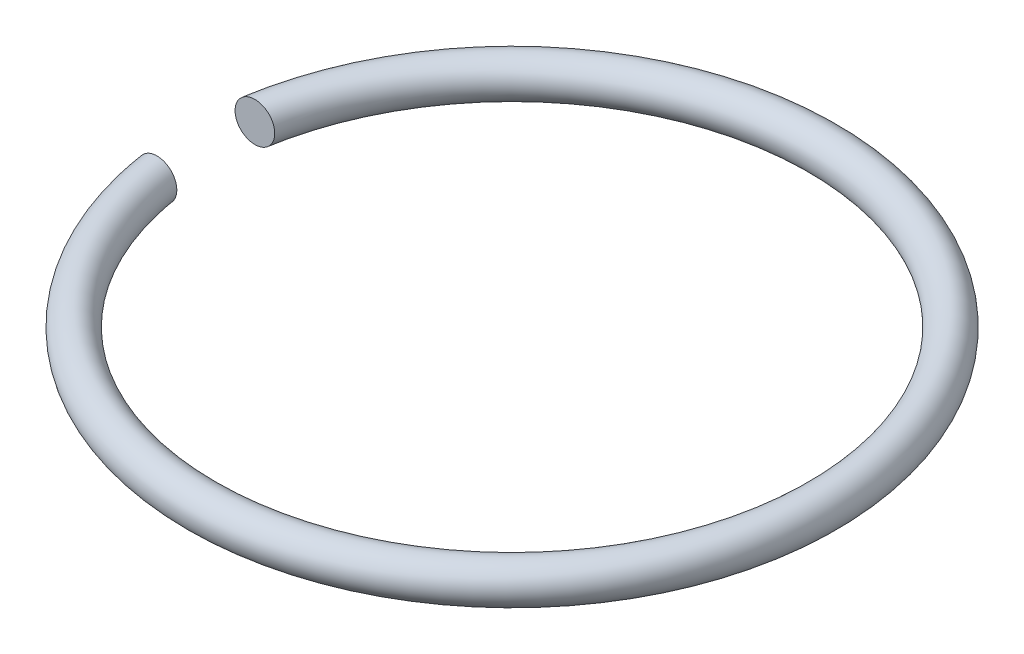
ISO-10303-21;
HEADER;
FILE_DESCRIPTION(('STEP AP214'),'2;1');
FILE_NAME('part.step','',(''),(''),'','','');
FILE_SCHEMA(('AUTOMOTIVE_DESIGN { 1 0 10303 214 1 1 1 1 }'));
ENDSEC;
DATA;
#1=APPLICATION_CONTEXT('core data for automotive mechanical design processes');
#2=APPLICATION_PROTOCOL_DEFINITION('international standard','automotive_design',2000,#1);
#3=PRODUCT_CONTEXT('',#1,'mechanical');
#4=PRODUCT('Part','Part','',(#3));
#5=PRODUCT_RELATED_PRODUCT_CATEGORY('part','',(#4));
#6=PRODUCT_DEFINITION_FORMATION('','',#4);
#7=PRODUCT_DEFINITION_CONTEXT('part definition',#1,'design');
#8=PRODUCT_DEFINITION('design','',#6,#7);
#9=PRODUCT_DEFINITION_SHAPE('','',#8);
#10=(LENGTH_UNIT() NAMED_UNIT(*) SI_UNIT(.MILLI.,.METRE.));
#11=(NAMED_UNIT(*) PLANE_ANGLE_UNIT() SI_UNIT($,.RADIAN.));
#12=(NAMED_UNIT(*) SI_UNIT($,.STERADIAN.) SOLID_ANGLE_UNIT());
#13=UNCERTAINTY_MEASURE_WITH_UNIT(LENGTH_MEASURE(1.E-05),#10,'distance_accuracy_value','');
#14=(GEOMETRIC_REPRESENTATION_CONTEXT(3) GLOBAL_UNCERTAINTY_ASSIGNED_CONTEXT((#13)) GLOBAL_UNIT_ASSIGNED_CONTEXT((#10,
#11,#12)) REPRESENTATION_CONTEXT('',''));
#15=CARTESIAN_POINT('',(0.,0.,0.));
#16=DIRECTION('',(0.,0.,1.));
#17=DIRECTION('',(1.,0.,0.));
#18=AXIS2_PLACEMENT_3D('',#15,#16,#17);
#19=CARTESIAN_POINT('',(0.,0.,0.));
#20=DIRECTION('',(0.,-1.,0.));
#21=DIRECTION('',(0.,0.,-1.));
#22=AXIS2_PLACEMENT_3D('',#19,#20,#21);
#23=TOROIDAL_SURFACE('',#22,9.5,0.6);
#24=CARTESIAN_POINT('',(-9.90918934467898,-0.295694588418098,1.5));
#25=CARTESIAN_POINT('',(-9.89235176297286,-0.325084884106954,1.5));
#26=CARTESIAN_POINT('',(-9.87299806537925,-0.353064009952844,1.5));
#27=CARTESIAN_POINT('',(-9.82983776787072,-0.405386688377729,1.5));
#28=CARTESIAN_POINT('',(-9.8060253157122,-0.429725386394075,1.5));
#29=CARTESIAN_POINT('',(-9.75468320221522,-0.474049548580785,1.5));
#30=CARTESIAN_POINT('',(-9.72715713604399,-0.494039174804915,1.5));
#31=CARTESIAN_POINT('',(-9.6691715035482,-0.529152386603416,1.5));
#32=CARTESIAN_POINT('',(-9.63871265399831,-0.544277157249969,1.5));
#33=CARTESIAN_POINT('',(-9.57544495495714,-0.569381697490342,1.5));
#34=CARTESIAN_POINT('',(-9.54261840053594,-0.579316846333761,1.5));
#35=CARTESIAN_POINT('',(-9.47576880604907,-0.593591583199508,1.5));
#36=CARTESIAN_POINT('',(-9.44174565010229,-0.597930627743449,1.5));
#37=CARTESIAN_POINT('',(-9.373136684303,-0.600918077224366,1.5));
#38=CARTESIAN_POINT('',(-9.33854857626074,-0.599513898799929,1.5));
#39=CARTESIAN_POINT('',(-9.27009432910497,-0.590936971880836,1.5));
#40=CARTESIAN_POINT('',(-9.23622821040076,-0.583764060536236,1.5));
#41=CARTESIAN_POINT('',(-9.17008270539161,-0.563812620001006,1.5));
#42=CARTESIAN_POINT('',(-9.13780811180835,-0.551018187267294,1.5));
#43=CARTESIAN_POINT('',(-9.07588127963409,-0.520163574858099,1.5));
#44=CARTESIAN_POINT('',(-9.04622899087471,-0.502103495950254,1.5));
#45=CARTESIAN_POINT('',(-8.99057485078488,-0.461323184437788,1.5));
#46=CARTESIAN_POINT('',(-8.96455370578505,-0.438629294588949,1.5));
#47=CARTESIAN_POINT('',(-8.91674848738194,-0.389146725096677,1.5));
#48=CARTESIAN_POINT('',(-8.89496414913901,-0.362358301586586,1.5));
#49=CARTESIAN_POINT('',(-8.85653872269795,-0.305792569390791,1.5));
#50=CARTESIAN_POINT('',(-8.83983834203544,-0.276055544304358,1.5));
#51=CARTESIAN_POINT('',(-8.81174427760562,-0.214172183704338,1.5));
#52=CARTESIAN_POINT('',(-8.80035016448414,-0.182026043367625,1.5));
#53=CARTESIAN_POINT('',(-8.78334153808978,-0.116692967203398,1.5));
#54=CARTESIAN_POINT('',(-8.7776527930337,-0.0835253456357243,1.5));
#55=CARTESIAN_POINT('',(-8.7719711356941,-0.0167063948460827,1.5));
#56=CARTESIAN_POINT('',(-8.77197791797762,0.0169449083408046,1.5));
#57=CARTESIAN_POINT('',(-8.77766493790006,0.0835094687964623,1.5));
#58=CARTESIAN_POINT('',(-8.78330273201153,0.116426364080587,1.5));
#59=CARTESIAN_POINT('',(-8.80001366357416,0.180849193840094,1.5));
#60=CARTESIAN_POINT('',(-8.81108679398344,0.21235513014342,1.5));
#61=CARTESIAN_POINT('',(-8.83836058382412,0.273142019148991,1.5));
#62=CARTESIAN_POINT('',(-8.85457205149317,0.302418119021929,1.5));
#63=CARTESIAN_POINT('',(-8.89163142415598,0.357870590403536,1.5));
#64=CARTESIAN_POINT('',(-8.91247954872469,0.384046815023558,1.5));
#65=CARTESIAN_POINT('',(-8.95844742748405,0.432855583958319,1.5));
#66=CARTESIAN_POINT('',(-8.98360966937988,0.455448104048551,1.5));
#67=CARTESIAN_POINT('',(-9.03732650446846,0.496155884119104,1.5));
#68=CARTESIAN_POINT('',(-9.06588133703641,0.514270827891459,1.5));
#69=CARTESIAN_POINT('',(-9.1259860290483,0.545764191670517,1.5));
#70=CARTESIAN_POINT('',(-9.15757106726948,0.559075484518403,1.5));
#71=CARTESIAN_POINT('',(-9.22251358665197,0.580267017721946,1.5));
#72=CARTESIAN_POINT('',(-9.25587117765544,0.588146921079717,1.5));
#73=CARTESIAN_POINT('',(-9.32377333984034,0.598319780222818,1.5));
#74=CARTESIAN_POINT('',(-9.35832649571296,0.600555515213395,1.5));
#75=CARTESIAN_POINT('',(-9.42732018269063,0.599210756917954,1.5));
#76=CARTESIAN_POINT('',(-9.46176071098704,0.595630119677225,1.5));
#77=CARTESIAN_POINT('',(-9.52963894921905,0.582725252633476,1.5));
#78=CARTESIAN_POINT('',(-9.56307394014596,0.573386702263538,1.5));
#79=CARTESIAN_POINT('',(-9.62788817744456,0.549198123642461,1.5));
#80=CARTESIAN_POINT('',(-9.65926746021191,0.534348192999649,1.5));
#81=CARTESIAN_POINT('',(-9.71888603754249,0.499634653744909,1.5));
#82=CARTESIAN_POINT('',(-9.74714177509833,0.479799296221027,1.5));
#83=CARTESIAN_POINT('',(-9.79987643807874,0.435619161024928,1.5));
#84=CARTESIAN_POINT('',(-9.82435556144957,0.411274619842909,1.5));
#85=CARTESIAN_POINT('',(-9.8685625613346,0.359041256857114,1.5));
#86=CARTESIAN_POINT('',(-9.88833800487401,0.331192695925897,1.5));
#87=CARTESIAN_POINT('',(-9.92287054540973,0.272542053038267,1.5));
#88=CARTESIAN_POINT('',(-9.9376281631205,0.241740277971054,1.5));
#89=CARTESIAN_POINT('',(-9.96153974869585,0.178426277146216,1.5));
#90=CARTESIAN_POINT('',(-9.97075428494011,0.145936917000195,1.5));
#91=CARTESIAN_POINT('',(-9.98355604508848,0.0798586714918838,1.5));
#92=CARTESIAN_POINT('',(-9.98714210315785,0.0462695598069422,1.5));
#93=CARTESIAN_POINT('',(-9.98857020053317,-0.0208026217771383,1.5));
#94=CARTESIAN_POINT('',(-9.98645030502865,-0.0542849099009689,1.5));
#95=CARTESIAN_POINT('',(-9.9766111991367,-0.120386917499048,1.5));
#96=CARTESIAN_POINT('',(-9.96889896460701,-0.153007659170969,1.5));
#97=CARTESIAN_POINT('',(-9.95221301581451,-0.204004043732796,1.5));
#98=CARTESIAN_POINT('',(-9.94492144392829,-0.222947176612434,1.5));
#99=CARTESIAN_POINT('',(-9.92845036811902,-0.259993702504052,1.5));
#100=CARTESIAN_POINT('',(-9.9192708746347,-0.278097100158434,1.5));
#101=CARTESIAN_POINT('',(-9.90918934467898,-0.295694588418098,1.5));
#102=B_SPLINE_CURVE_WITH_KNOTS('',3,(#24,#25,#26,#27,#28,#29,#30,#31,#32,#33,#34,#35,#36,#37,
#38,#39,#40,#41,#42,#43,#44,#45,#46,#47,#48,#49,#50,#51,#52,#53,#54,#55,#56,#57,#58,#59,#60,#61,
#62,#63,#64,#65,#66,#67,#68,#69,#70,#71,#72,#73,#74,#75,#76,#77,#78,#79,#80,#81,#82,#83,#84,#85,
#86,#87,#88,#89,#90,#91,#92,#93,#94,#95,#96,#97,#98,#99,#100,#101),.UNSPECIFIED.,.T.,.F.,(4,2,2,
2,2,2,2,2,2,2,2,2,2,2,2,2,2,2,2,2,2,2,2,2,2,2,2,2,2,2,2,2,2,2,2,2,2,2,4),(0.,0.101540104471026,
0.203214429525217,0.30479102021172,0.406342848206607,0.508754021600642,0.611175140139748,
0.714536087451958,0.817899952721275,0.921558141137248,1.02521434599701,1.12829690947454,
1.23137302726472,1.33319637177963,1.43501147587413,1.53548398875674,1.6359511136195,
1.73566664341899,1.83538204402998,1.93530859876743,2.03523988666573,2.1362187355129,
2.23720471348467,2.33955173397394,2.44190510415061,2.54529204378119,2.64868154226858,
2.75232922494755,2.85597507208014,2.95904633003675,3.0621121838125,3.16408665278553,
3.2660505363378,3.36687902286916,3.4677283913943,3.56790665043484,3.66796016207542,
3.72875780408996,3.78955510995006),.UNSPECIFIED.);
#103=CARTESIAN_POINT('',(-9.90918934467898,-0.295694588418098,1.5));
#104=VERTEX_POINT('',#103);
#105=EDGE_CURVE('E43',#104,#104,#102,.T.);
#106=ORIENTED_EDGE('',*,*,#105,.T.);
#107=EDGE_LOOP('',(#106));
#108=FACE_BOUND('',#107,.T.);
#109=CARTESIAN_POINT('',(-9.90918934467898,-0.295694588418098,-1.5));
#110=CARTESIAN_POINT('',(-9.92579979762233,-0.266694663466785,-1.5));
#111=CARTESIAN_POINT('',(-9.93998506099733,-0.236279144917442,-1.5));
#112=CARTESIAN_POINT('',(-9.96306337297348,-0.173475454137592,-1.5));
#113=CARTESIAN_POINT('',(-9.97195061453031,-0.141085160088875,-1.5));
#114=CARTESIAN_POINT('',(-9.9841479591284,-0.0752761991183647,-1.5));
#115=CARTESIAN_POINT('',(-9.98745951434027,-0.041857802272424,-1.5));
#116=CARTESIAN_POINT('',(-9.9884070471431,0.0250509821326235,-1.5));
#117=CARTESIAN_POINT('',(-9.98604434349421,0.0585413511571749,-1.5));
#118=CARTESIAN_POINT('',(-9.97573153863154,0.12456344275426,-1.5));
#119=CARTESIAN_POINT('',(-9.96779551311539,0.157097365680653,-1.5));
#120=CARTESIAN_POINT('',(-9.94658893582143,0.220377714485177,-1.5));
#121=CARTESIAN_POINT('',(-9.9333181773479,0.25112407105071,-1.5));
#122=CARTESIAN_POINT('',(-9.90179048513171,0.310056282108592,-1.5));
#123=CARTESIAN_POINT('',(-9.88351941275412,0.338234569470686,-1.5));
#124=CARTESIAN_POINT('',(-9.84254378907404,0.391157357275991,-1.5));
#125=CARTESIAN_POINT('',(-9.81983907647703,0.415901732738458,-1.5));
#126=CARTESIAN_POINT('',(-9.77043587495346,0.461488080998418,-1.5));
#127=CARTESIAN_POINT('',(-9.74370456031879,0.482294472591357,-1.5));
#128=CARTESIAN_POINT('',(-9.68716077214321,0.519183305286885,-1.5));
#129=CARTESIAN_POINT('',(-9.65734812448921,0.535265479246437,-1.5));
#130=CARTESIAN_POINT('',(-9.59512742357177,0.562441018106362,-1.5));
#131=CARTESIAN_POINT('',(-9.56269384427681,0.573475942770253,-1.5));
#132=CARTESIAN_POINT('',(-9.49644372657044,0.590002231057013,-1.5));
#133=CARTESIAN_POINT('',(-9.46262710663074,0.595493267383931,-1.5));
#134=CARTESIAN_POINT('',(-9.39422360220229,0.600819479620812,-1.5));
#135=CARTESIAN_POINT('',(-9.35963243885431,0.60059981221719,-1.5));
#136=CARTESIAN_POINT('',(-9.29097308668583,0.594379477896506,-1.5));
#137=CARTESIAN_POINT('',(-9.25690491527294,0.588378618976408,-1.5));
#138=CARTESIAN_POINT('',(-9.19013196776455,0.570724181478461,-1.5));
#139=CARTESIAN_POINT('',(-9.1574326021009,0.559050119448001,-1.5));
#140=CARTESIAN_POINT('',(-9.09447046748701,0.530353125015471,-1.5));
#141=CARTESIAN_POINT('',(-9.06420767020454,0.513330254820198,-1.5));
#142=CARTESIAN_POINT('',(-9.00714030700244,0.474489309227562,-1.5));
#143=CARTESIAN_POINT('',(-8.98032019586097,0.452694084949577,-1.5));
#144=CARTESIAN_POINT('',(-8.93077351385033,0.404861947360151,-1.5));
#145=CARTESIAN_POINT('',(-8.90804669792698,0.378825288149447,-1.5));
#146=CARTESIAN_POINT('',(-8.86762151590915,0.32357081999775,-1.5));
#147=CARTESIAN_POINT('',(-8.84986750922209,0.294393726237614,-1.5));
#148=CARTESIAN_POINT('',(-8.81958735056502,0.233442119241933,-1.5));
#149=CARTESIAN_POINT('',(-8.80706077653348,0.201667815952216,-1.5));
#150=CARTESIAN_POINT('',(-8.78776108419907,0.13688186369965,-1.5));
#151=CARTESIAN_POINT('',(-8.78091310348694,0.103892506490752,-1.5));
#152=CARTESIAN_POINT('',(-8.77290461740382,0.0372310748749337,-1.5));
#153=CARTESIAN_POINT('',(-8.77174378048757,0.00355904038118952,-1.5));
#154=CARTESIAN_POINT('',(-8.77513120596553,-0.0632142654133759,-1.5));
#155=CARTESIAN_POINT('',(-8.7796320585354,-0.096317954587314,-1.5));
#156=CARTESIAN_POINT('',(-8.79412230073816,-0.161300444207012,-1.5));
#157=CARTESIAN_POINT('',(-8.80411165470911,-0.193179252610087,-1.5));
#158=CARTESIAN_POINT('',(-8.82928764280445,-0.254853411131766,-1.5));
#159=CARTESIAN_POINT('',(-8.84448001150296,-0.284646418532229,-1.5));
#160=CARTESIAN_POINT('',(-8.87960433423301,-0.341292361871657,-1.5));
#161=CARTESIAN_POINT('',(-8.8995364883295,-0.368145173635936,-1.5));
#162=CARTESIAN_POINT('',(-8.94377610154994,-0.418437180572199,-1.5));
#163=CARTESIAN_POINT('',(-8.96812462946735,-0.441840239415841,-1.5));
#164=CARTESIAN_POINT('',(-9.02035950331156,-0.484292525192654,-1.5));
#165=CARTESIAN_POINT('',(-9.04824610264033,-0.503341440001462,-1.5));
#166=CARTESIAN_POINT('',(-9.10716851374812,-0.536814344397623,-1.5));
#167=CARTESIAN_POINT('',(-9.13824169473145,-0.551172560528149,-1.5));
#168=CARTESIAN_POINT('',(-9.20234055387563,-0.574531797705833,-1.5));
#169=CARTESIAN_POINT('',(-9.23536636015628,-0.583532466792449,-1.5));
#170=CARTESIAN_POINT('',(-9.30281280468173,-0.596007648736926,-1.5));
#171=CARTESIAN_POINT('',(-9.33724459373376,-0.59942194111716,-1.5));
#172=CARTESIAN_POINT('',(-9.40619363659807,-0.600443111619268,-1.5));
#173=CARTESIAN_POINT('',(-9.44071088972766,-0.598050035982057,-1.5));
#174=CARTESIAN_POINT('',(-9.5089686896211,-0.587497336096796,-1.5));
#175=CARTESIAN_POINT('',(-9.54270634185045,-0.579318963388803,-1.5));
#176=CARTESIAN_POINT('',(-9.60832816992213,-0.557384441506258,-1.5));
#177=CARTESIAN_POINT('',(-9.64021191396521,-0.543626998796869,-1.5));
#178=CARTESIAN_POINT('',(-9.70105202482917,-0.510978629415401,-1.5));
#179=CARTESIAN_POINT('',(-9.73002047990233,-0.492110209457543,-1.5));
#180=CARTESIAN_POINT('',(-9.78430796308976,-0.449742434304425,-1.5));
#181=CARTESIAN_POINT('',(-9.80963153425368,-0.426248931958808,-1.5));
#182=CARTESIAN_POINT('',(-9.84734504955158,-0.384717731133374,-1.5));
#183=CARTESIAN_POINT('',(-9.86106049347548,-0.367863520972192,-1.5));
#184=CARTESIAN_POINT('',(-9.88658812197516,-0.33277014060214,-1.5));
#185=CARTESIAN_POINT('',(-9.89840031773631,-0.314530978533545,-1.5));
#186=CARTESIAN_POINT('',(-9.90918934467898,-0.295694588418098,-1.5));
#187=B_SPLINE_CURVE_WITH_KNOTS('',3,(#109,#110,#111,#112,#113,#114,#115,#116,#117,#118,#119,
#120,#121,#122,#123,#124,#125,#126,#127,#128,#129,#130,#131,#132,#133,#134,#135,#136,#137,#138,
#139,#140,#141,#142,#143,#144,#145,#146,#147,#148,#149,#150,#151,#152,#153,#154,#155,#156,#157,
#158,#159,#160,#161,#162,#163,#164,#165,#166,#167,#168,#169,#170,#171,#172,#173,#174,#175,#176,
#177,#178,#179,#180,#181,#182,#183,#184,#185,#186),.UNSPECIFIED.,.T.,.F.,(4,2,2,2,2,2,2,2,2,2,2,
2,2,2,2,2,2,2,2,2,2,2,2,2,2,2,2,2,2,2,2,2,2,2,2,2,2,2,4),(0.,0.100181680637411,
0.200472967258703,0.3007381292755,0.400979990820998,0.500969592841044,0.60096306935966,
0.701242256851553,0.801525093150626,0.902674773533091,1.00383017258381,1.1061288763849,
1.20843361926758,1.31172121571921,1.41501224264288,1.51867901065102,1.62234457305621,
1.72552421239955,1.82869767261076,1.93066586618727,2.03262582528533,2.13321923159418,
2.23380677350723,2.33355759547845,2.43330776931889,2.53316823989792,2.63303292630649,
2.73387892075839,2.83473214203307,2.93694423819969,3.03916304838211,3.14247667440523,
3.24578947780079,3.34943863082016,3.4531118291579,3.55633571217585,3.65942979972543,
3.72450142707565,3.78957267198665),.UNSPECIFIED.);
#188=CARTESIAN_POINT('',(-9.90918934467898,-0.295694588418098,-1.5));
#189=VERTEX_POINT('',#188);
#190=EDGE_CURVE('E10',#189,#189,#187,.T.);
#191=ORIENTED_EDGE('',*,*,#190,.T.);
#192=EDGE_LOOP('',(#191));
#193=FACE_BOUND('',#192,.T.);
#194=ADVANCED_FACE('F32',(#108,#193),#23,.T.);
#195=CARTESIAN_POINT('',(-12.1619974968585,-0.6,1.5));
#196=DIRECTION('',(0.,0.,1.));
#197=DIRECTION('',(1.,0.,0.));
#198=AXIS2_PLACEMENT_3D('',#195,#196,#197);
#199=PLANE('',#198);
#200=ORIENTED_EDGE('',*,*,#105,.F.);
#201=EDGE_LOOP('',(#200));
#202=FACE_BOUND('',#201,.T.);
#203=ADVANCED_FACE('F52',(#202),#199,.F.);
#204=CARTESIAN_POINT('',(-12.1619974968585,-0.6,-1.5));
#205=DIRECTION('',(0.,0.,-1.));
#206=DIRECTION('',(-1.,0.,0.));
#207=AXIS2_PLACEMENT_3D('',#204,#205,#206);
#208=PLANE('',#207);
#209=ORIENTED_EDGE('',*,*,#190,.F.);
#210=EDGE_LOOP('',(#209));
#211=FACE_BOUND('',#210,.T.);
#212=ADVANCED_FACE('F55',(#211),#208,.F.);
#213=CLOSED_SHELL('',(#194,#203,#212));
#214=MANIFOLD_SOLID_BREP('B2',#213);
#215=ADVANCED_BREP_SHAPE_REPRESENTATION('',(#18,#214),#14);
#216=SHAPE_DEFINITION_REPRESENTATION(#9,#215);
ENDSEC;
END-ISO-10303-21;
